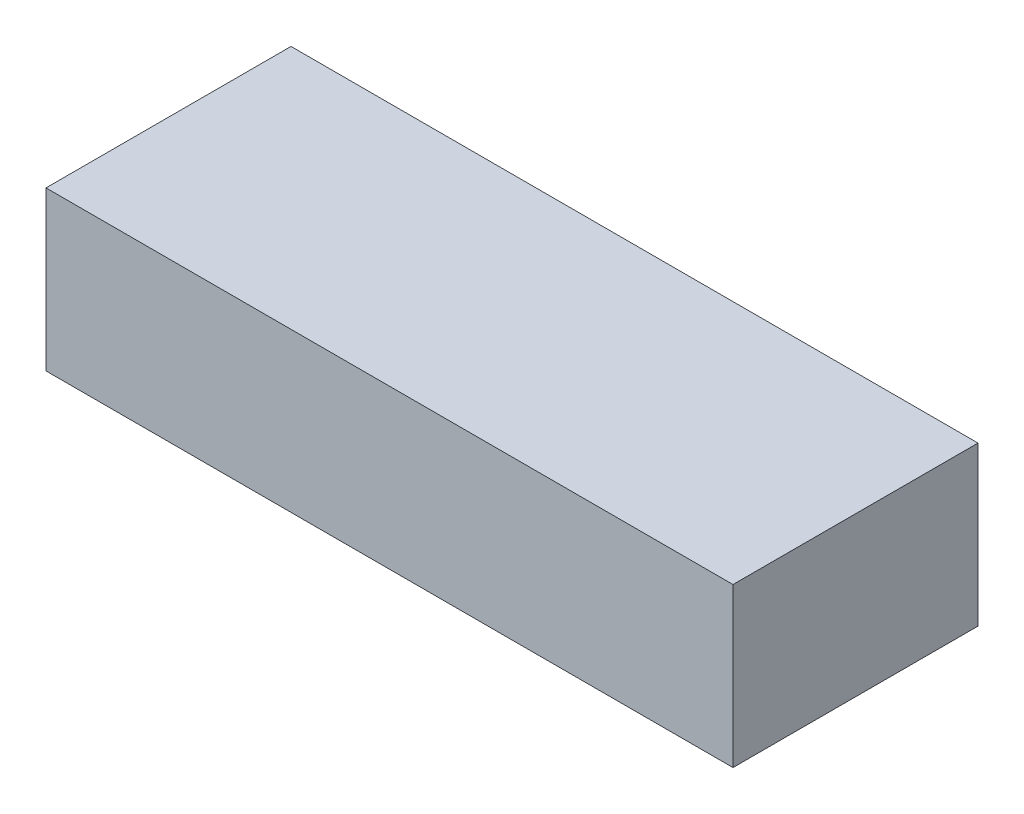
ISO-10303-21;
HEADER;
FILE_DESCRIPTION(('STEP AP214'),'2;1');
FILE_NAME('part.step','',(''),(''),'','','');
FILE_SCHEMA(('AUTOMOTIVE_DESIGN { 1 0 10303 214 1 1 1 1 }'));
ENDSEC;
DATA;
#1=APPLICATION_CONTEXT('core data for automotive mechanical design processes');
#2=APPLICATION_PROTOCOL_DEFINITION('international standard','automotive_design',2000,#1);
#3=PRODUCT_CONTEXT('',#1,'mechanical');
#4=PRODUCT('Part','Part','',(#3));
#5=PRODUCT_RELATED_PRODUCT_CATEGORY('part','',(#4));
#6=PRODUCT_DEFINITION_FORMATION('','',#4);
#7=PRODUCT_DEFINITION_CONTEXT('part definition',#1,'design');
#8=PRODUCT_DEFINITION('design','',#6,#7);
#9=PRODUCT_DEFINITION_SHAPE('','',#8);
#10=(LENGTH_UNIT() NAMED_UNIT(*) SI_UNIT(.MILLI.,.METRE.));
#11=(NAMED_UNIT(*) PLANE_ANGLE_UNIT() SI_UNIT($,.RADIAN.));
#12=(NAMED_UNIT(*) SI_UNIT($,.STERADIAN.) SOLID_ANGLE_UNIT());
#13=UNCERTAINTY_MEASURE_WITH_UNIT(LENGTH_MEASURE(1.E-05),#10,'distance_accuracy_value','');
#14=(GEOMETRIC_REPRESENTATION_CONTEXT(3) GLOBAL_UNCERTAINTY_ASSIGNED_CONTEXT((#13)) GLOBAL_UNIT_ASSIGNED_CONTEXT((#10,
#11,#12)) REPRESENTATION_CONTEXT('',''));
#15=CARTESIAN_POINT('',(0.,0.,0.));
#16=DIRECTION('',(0.,0.,1.));
#17=DIRECTION('',(1.,0.,0.));
#18=AXIS2_PLACEMENT_3D('',#15,#16,#17);
#19=CARTESIAN_POINT('',(-71.5,33.,25.5));
#20=DIRECTION('',(1.,0.,0.));
#21=DIRECTION('',(0.,0.,-1.));
#22=AXIS2_PLACEMENT_3D('',#19,#20,#21);
#23=PLANE('',#22);
#24=DIRECTION('',(0.,0.,1.));
#25=VECTOR('',#24,1.);
#26=CARTESIAN_POINT('',(-71.5,0.,25.5));
#27=LINE('',#26,#25);
#28=CARTESIAN_POINT('',(-71.5,0.,-25.5));
#29=VERTEX_POINT('',#28);
#30=CARTESIAN_POINT('',(-71.5,0.,25.5));
#31=VERTEX_POINT('',#30);
#32=EDGE_CURVE('E95',#29,#31,#27,.T.);
#33=ORIENTED_EDGE('',*,*,#32,.T.);
#34=DIRECTION('',(0.,-1.,0.));
#35=VECTOR('',#34,1.);
#36=CARTESIAN_POINT('',(-71.5,33.,25.5));
#37=LINE('',#36,#35);
#38=CARTESIAN_POINT('',(-71.5,33.,25.5));
#39=VERTEX_POINT('',#38);
#40=EDGE_CURVE('E11',#39,#31,#37,.T.);
#41=ORIENTED_EDGE('',*,*,#40,.F.);
#42=DIRECTION('',(0.,0.,1.));
#43=VECTOR('',#42,1.);
#44=CARTESIAN_POINT('',(-71.5,33.,25.5));
#45=LINE('',#44,#43);
#46=CARTESIAN_POINT('',(-71.5,33.,-25.5));
#47=VERTEX_POINT('',#46);
#48=EDGE_CURVE('E83',#47,#39,#45,.T.);
#49=ORIENTED_EDGE('',*,*,#48,.F.);
#50=DIRECTION('',(0.,-1.,0.));
#51=VECTOR('',#50,1.);
#52=CARTESIAN_POINT('',(-71.5,33.,-25.5));
#53=LINE('',#52,#51);
#54=EDGE_CURVE('E91',#47,#29,#53,.T.);
#55=ORIENTED_EDGE('',*,*,#54,.T.);
#56=EDGE_LOOP('',(#33,#41,#49,#55));
#57=FACE_BOUND('',#56,.T.);
#58=ADVANCED_FACE('F32',(#57),#23,.F.);
#59=CARTESIAN_POINT('',(71.5,33.,25.5));
#60=DIRECTION('',(0.,0.,-1.));
#61=DIRECTION('',(-1.,0.,0.));
#62=AXIS2_PLACEMENT_3D('',#59,#60,#61);
#63=PLANE('',#62);
#64=DIRECTION('',(1.,0.,0.));
#65=VECTOR('',#64,1.);
#66=CARTESIAN_POINT('',(71.5,0.,25.5));
#67=LINE('',#66,#65);
#68=CARTESIAN_POINT('',(71.5,0.,25.5));
#69=VERTEX_POINT('',#68);
#70=EDGE_CURVE('E87',#31,#69,#67,.T.);
#71=ORIENTED_EDGE('',*,*,#70,.T.);
#72=DIRECTION('',(0.,-1.,0.));
#73=VECTOR('',#72,1.);
#74=CARTESIAN_POINT('',(71.5,33.,25.5));
#75=LINE('',#74,#73);
#76=CARTESIAN_POINT('',(71.5,33.,25.5));
#77=VERTEX_POINT('',#76);
#78=EDGE_CURVE('E40',#77,#69,#75,.T.);
#79=ORIENTED_EDGE('',*,*,#78,.F.);
#80=DIRECTION('',(1.,0.,0.));
#81=VECTOR('',#80,1.);
#82=CARTESIAN_POINT('',(71.5,33.,25.5));
#83=LINE('',#82,#81);
#84=EDGE_CURVE('E78',#39,#77,#83,.T.);
#85=ORIENTED_EDGE('',*,*,#84,.F.);
#86=ORIENTED_EDGE('',*,*,#40,.T.);
#87=EDGE_LOOP('',(#71,#79,#85,#86));
#88=FACE_BOUND('',#87,.T.);
#89=ADVANCED_FACE('F86',(#88),#63,.F.);
#90=CARTESIAN_POINT('',(71.5,33.,25.5));
#91=DIRECTION('',(-1.,0.,0.));
#92=DIRECTION('',(0.,0.,1.));
#93=AXIS2_PLACEMENT_3D('',#90,#91,#92);
#94=PLANE('',#93);
#95=DIRECTION('',(0.,0.,-1.));
#96=VECTOR('',#95,1.);
#97=CARTESIAN_POINT('',(71.5,0.,25.5));
#98=LINE('',#97,#96);
#99=CARTESIAN_POINT('',(71.5,0.,-25.5));
#100=VERTEX_POINT('',#99);
#101=EDGE_CURVE('E65',#69,#100,#98,.T.);
#102=ORIENTED_EDGE('',*,*,#101,.T.);
#103=DIRECTION('',(0.,-1.,0.));
#104=VECTOR('',#103,1.);
#105=CARTESIAN_POINT('',(71.5,33.,-25.5));
#106=LINE('',#105,#104);
#107=CARTESIAN_POINT('',(71.5,33.,-25.5));
#108=VERTEX_POINT('',#107);
#109=EDGE_CURVE('E88',#108,#100,#106,.T.);
#110=ORIENTED_EDGE('',*,*,#109,.F.);
#111=DIRECTION('',(0.,0.,-1.));
#112=VECTOR('',#111,1.);
#113=CARTESIAN_POINT('',(71.5,33.,25.5));
#114=LINE('',#113,#112);
#115=EDGE_CURVE('E81',#77,#108,#114,.T.);
#116=ORIENTED_EDGE('',*,*,#115,.F.);
#117=ORIENTED_EDGE('',*,*,#78,.T.);
#118=EDGE_LOOP('',(#102,#110,#116,#117));
#119=FACE_BOUND('',#118,.T.);
#120=ADVANCED_FACE('F89',(#119),#94,.F.);
#121=CARTESIAN_POINT('',(71.5,33.,-25.5));
#122=DIRECTION('',(0.,0.,1.));
#123=DIRECTION('',(1.,0.,0.));
#124=AXIS2_PLACEMENT_3D('',#121,#122,#123);
#125=PLANE('',#124);
#126=DIRECTION('',(-1.,0.,0.));
#127=VECTOR('',#126,1.);
#128=CARTESIAN_POINT('',(71.5,0.,-25.5));
#129=LINE('',#128,#127);
#130=EDGE_CURVE('E71',#100,#29,#129,.T.);
#131=ORIENTED_EDGE('',*,*,#130,.T.);
#132=ORIENTED_EDGE('',*,*,#54,.F.);
#133=DIRECTION('',(-1.,0.,0.));
#134=VECTOR('',#133,1.);
#135=CARTESIAN_POINT('',(71.5,33.,-25.5));
#136=LINE('',#135,#134);
#137=EDGE_CURVE('E48',#108,#47,#136,.T.);
#138=ORIENTED_EDGE('',*,*,#137,.F.);
#139=ORIENTED_EDGE('',*,*,#109,.T.);
#140=EDGE_LOOP('',(#131,#132,#138,#139));
#141=FACE_BOUND('',#140,.T.);
#142=ADVANCED_FACE('F102',(#141),#125,.F.);
#143=CARTESIAN_POINT('',(0.,33.,0.));
#144=DIRECTION('',(0.,1.,0.));
#145=DIRECTION('',(0.,0.,1.));
#146=AXIS2_PLACEMENT_3D('',#143,#144,#145);
#147=PLANE('',#146);
#148=ORIENTED_EDGE('',*,*,#48,.T.);
#149=ORIENTED_EDGE('',*,*,#84,.T.);
#150=ORIENTED_EDGE('',*,*,#115,.T.);
#151=ORIENTED_EDGE('',*,*,#137,.T.);
#152=EDGE_LOOP('',(#148,#149,#150,#151));
#153=FACE_BOUND('',#152,.T.);
#154=ADVANCED_FACE('F79',(#153),#147,.T.);
#155=CARTESIAN_POINT('',(0.,0.,0.));
#156=DIRECTION('',(0.,1.,0.));
#157=DIRECTION('',(0.,0.,1.));
#158=AXIS2_PLACEMENT_3D('',#155,#156,#157);
#159=PLANE('',#158);
#160=ORIENTED_EDGE('',*,*,#32,.F.);
#161=ORIENTED_EDGE('',*,*,#130,.F.);
#162=ORIENTED_EDGE('',*,*,#101,.F.);
#163=ORIENTED_EDGE('',*,*,#70,.F.);
#164=EDGE_LOOP('',(#160,#161,#162,#163));
#165=FACE_BOUND('',#164,.T.);
#166=ADVANCED_FACE('F105',(#165),#159,.F.);
#167=CLOSED_SHELL('',(#58,#89,#120,#142,#154,#166));
#168=MANIFOLD_SOLID_BREP('B2',#167);
#169=ADVANCED_BREP_SHAPE_REPRESENTATION('',(#18,#168),#14);
#170=SHAPE_DEFINITION_REPRESENTATION(#9,#169);
ENDSEC;
END-ISO-10303-21;
